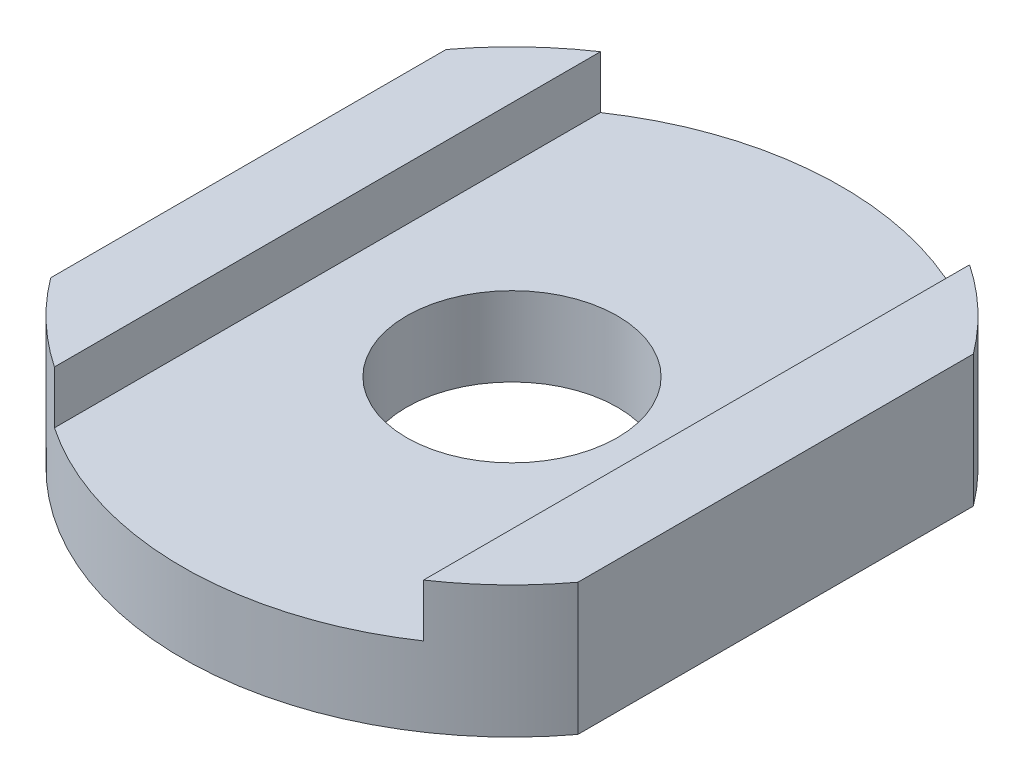
ISO-10303-21;
HEADER;
FILE_DESCRIPTION(('STEP AP214'),'2;1');
FILE_NAME('part.step','',(''),(''),'','','');
FILE_SCHEMA(('AUTOMOTIVE_DESIGN { 1 0 10303 214 1 1 1 1 }'));
ENDSEC;
DATA;
#1=APPLICATION_CONTEXT('core data for automotive mechanical design processes');
#2=APPLICATION_PROTOCOL_DEFINITION('international standard','automotive_design',2000,#1);
#3=PRODUCT_CONTEXT('',#1,'mechanical');
#4=PRODUCT('Part','Part','',(#3));
#5=PRODUCT_RELATED_PRODUCT_CATEGORY('part','',(#4));
#6=PRODUCT_DEFINITION_FORMATION('','',#4);
#7=PRODUCT_DEFINITION_CONTEXT('part definition',#1,'design');
#8=PRODUCT_DEFINITION('design','',#6,#7);
#9=PRODUCT_DEFINITION_SHAPE('','',#8);
#10=(LENGTH_UNIT() NAMED_UNIT(*) SI_UNIT(.MILLI.,.METRE.));
#11=(NAMED_UNIT(*) PLANE_ANGLE_UNIT() SI_UNIT($,.RADIAN.));
#12=(NAMED_UNIT(*) SI_UNIT($,.STERADIAN.) SOLID_ANGLE_UNIT());
#13=UNCERTAINTY_MEASURE_WITH_UNIT(LENGTH_MEASURE(1.E-05),#10,'distance_accuracy_value','');
#14=(GEOMETRIC_REPRESENTATION_CONTEXT(3) GLOBAL_UNCERTAINTY_ASSIGNED_CONTEXT((#13)) GLOBAL_UNIT_ASSIGNED_CONTEXT((#10,
#11,#12)) REPRESENTATION_CONTEXT('',''));
#15=CARTESIAN_POINT('',(0.,0.,0.));
#16=DIRECTION('',(0.,0.,1.));
#17=DIRECTION('',(1.,0.,0.));
#18=AXIS2_PLACEMENT_3D('',#15,#16,#17);
#19=CARTESIAN_POINT('',(0.,3.,0.));
#20=DIRECTION('',(0.,-1.,0.));
#21=DIRECTION('',(0.,0.,-1.));
#22=AXIS2_PLACEMENT_3D('',#19,#20,#21);
#23=CYLINDRICAL_SURFACE('',#22,12.5);
#24=CARTESIAN_POINT('',(0.,0.,0.));
#25=DIRECTION('',(0.,1.,0.));
#26=DIRECTION('',(0.,0.,1.));
#27=AXIS2_PLACEMENT_3D('',#24,#25,#26);
#28=CIRCLE('',#27,12.5);
#29=CARTESIAN_POINT('',(10.,0.,-7.5));
#30=VERTEX_POINT('',#29);
#31=CARTESIAN_POINT('',(-10.,0.,-7.5));
#32=VERTEX_POINT('',#31);
#33=EDGE_CURVE('E43',#30,#32,#28,.T.);
#34=ORIENTED_EDGE('',*,*,#33,.T.);
#35=DIRECTION('',(0.,-1.,0.));
#36=VECTOR('',#35,1.);
#37=CARTESIAN_POINT('',(-10.,5.,-7.5));
#38=LINE('',#37,#36);
#39=CARTESIAN_POINT('',(-10.,5.,-7.5));
#40=VERTEX_POINT('',#39);
#41=EDGE_CURVE('E151',#40,#32,#38,.T.);
#42=ORIENTED_EDGE('',*,*,#41,.F.);
#43=CARTESIAN_POINT('',(0.,5.,0.));
#44=DIRECTION('',(0.,1.,0.));
#45=DIRECTION('',(0.,0.,1.));
#46=AXIS2_PLACEMENT_3D('',#43,#44,#45);
#47=CIRCLE('',#46,12.5);
#48=CARTESIAN_POINT('',(-7.,5.,-10.356157588604));
#49=VERTEX_POINT('',#48);
#50=EDGE_CURVE('E141',#49,#40,#47,.T.);
#51=ORIENTED_EDGE('',*,*,#50,.F.);
#52=DIRECTION('',(0.,-1.,0.));
#53=VECTOR('',#52,1.);
#54=CARTESIAN_POINT('',(-7.,5.,-10.356157588604));
#55=LINE('',#54,#53);
#56=CARTESIAN_POINT('',(-7.,3.,-10.356157588604));
#57=VERTEX_POINT('',#56);
#58=EDGE_CURVE('E157',#49,#57,#55,.T.);
#59=ORIENTED_EDGE('',*,*,#58,.T.);
#60=CARTESIAN_POINT('',(0.,3.,0.));
#61=DIRECTION('',(0.,1.,0.));
#62=DIRECTION('',(0.,0.,1.));
#63=AXIS2_PLACEMENT_3D('',#60,#61,#62);
#64=CIRCLE('',#63,12.5);
#65=CARTESIAN_POINT('',(7.,3.,-10.356157588604));
#66=VERTEX_POINT('',#65);
#67=EDGE_CURVE('E57',#66,#57,#64,.T.);
#68=ORIENTED_EDGE('',*,*,#67,.F.);
#69=DIRECTION('',(0.,-1.,0.));
#70=VECTOR('',#69,1.);
#71=CARTESIAN_POINT('',(7.,5.,-10.356157588604));
#72=LINE('',#71,#70);
#73=CARTESIAN_POINT('',(7.,5.,-10.356157588604));
#74=VERTEX_POINT('',#73);
#75=EDGE_CURVE('E187',#74,#66,#72,.T.);
#76=ORIENTED_EDGE('',*,*,#75,.F.);
#77=CARTESIAN_POINT('',(0.,5.,0.));
#78=DIRECTION('',(0.,1.,0.));
#79=DIRECTION('',(0.,0.,1.));
#80=AXIS2_PLACEMENT_3D('',#77,#78,#79);
#81=CIRCLE('',#80,12.5);
#82=CARTESIAN_POINT('',(10.,5.,-7.5));
#83=VERTEX_POINT('',#82);
#84=EDGE_CURVE('E121',#83,#74,#81,.T.);
#85=ORIENTED_EDGE('',*,*,#84,.F.);
#86=DIRECTION('',(0.,-1.,0.));
#87=VECTOR('',#86,1.);
#88=CARTESIAN_POINT('',(10.,5.,-7.5));
#89=LINE('',#88,#87);
#90=EDGE_CURVE('E134',#83,#30,#89,.T.);
#91=ORIENTED_EDGE('',*,*,#90,.T.);
#92=EDGE_LOOP('',(#34,#42,#51,#59,#68,#76,#85,#91));
#93=FACE_BOUND('',#92,.T.);
#94=ADVANCED_FACE('F39',(#93),#23,.T.);
#95=CARTESIAN_POINT('',(-10.,0.,7.5));
#96=VERTEX_POINT('',#95);
#97=CARTESIAN_POINT('',(10.,0.,7.5));
#98=VERTEX_POINT('',#97);
#99=EDGE_CURVE('E163',#96,#98,#28,.T.);
#100=ORIENTED_EDGE('',*,*,#99,.T.);
#101=DIRECTION('',(0.,-1.,0.));
#102=VECTOR('',#101,1.);
#103=CARTESIAN_POINT('',(10.,5.,7.5));
#104=LINE('',#103,#102);
#105=CARTESIAN_POINT('',(10.,5.,7.5));
#106=VERTEX_POINT('',#105);
#107=EDGE_CURVE('E118',#106,#98,#104,.T.);
#108=ORIENTED_EDGE('',*,*,#107,.F.);
#109=CARTESIAN_POINT('',(7.,5.,10.356157588604));
#110=VERTEX_POINT('',#109);
#111=EDGE_CURVE('E107',#110,#106,#81,.T.);
#112=ORIENTED_EDGE('',*,*,#111,.F.);
#113=DIRECTION('',(0.,-1.,0.));
#114=VECTOR('',#113,1.);
#115=CARTESIAN_POINT('',(7.,5.,10.356157588604));
#116=LINE('',#115,#114);
#117=CARTESIAN_POINT('',(7.,3.,10.356157588604));
#118=VERTEX_POINT('',#117);
#119=EDGE_CURVE('E114',#110,#118,#116,.T.);
#120=ORIENTED_EDGE('',*,*,#119,.T.);
#121=CARTESIAN_POINT('',(-7.,3.,10.356157588604));
#122=VERTEX_POINT('',#121);
#123=EDGE_CURVE('E48',#122,#118,#64,.T.);
#124=ORIENTED_EDGE('',*,*,#123,.F.);
#125=DIRECTION('',(0.,-1.,0.));
#126=VECTOR('',#125,1.);
#127=CARTESIAN_POINT('',(-7.,5.,10.356157588604));
#128=LINE('',#127,#126);
#129=CARTESIAN_POINT('',(-7.,5.,10.356157588604));
#130=VERTEX_POINT('',#129);
#131=EDGE_CURVE('E62',#130,#122,#128,.T.);
#132=ORIENTED_EDGE('',*,*,#131,.F.);
#133=CARTESIAN_POINT('',(-10.,5.,7.5));
#134=VERTEX_POINT('',#133);
#135=EDGE_CURVE('E144',#134,#130,#47,.T.);
#136=ORIENTED_EDGE('',*,*,#135,.F.);
#137=DIRECTION('',(0.,-1.,0.));
#138=VECTOR('',#137,1.);
#139=CARTESIAN_POINT('',(-10.,5.,7.5));
#140=LINE('',#139,#138);
#141=EDGE_CURVE('E148',#134,#96,#140,.T.);
#142=ORIENTED_EDGE('',*,*,#141,.T.);
#143=EDGE_LOOP('',(#100,#108,#112,#120,#124,#132,#136,#142));
#144=FACE_BOUND('',#143,.T.);
#145=ADVANCED_FACE('F112',(#144),#23,.T.);
#146=CARTESIAN_POINT('',(0.,3.,0.));
#147=DIRECTION('',(0.,-1.,0.));
#148=DIRECTION('',(0.,0.,-1.));
#149=AXIS2_PLACEMENT_3D('',#146,#147,#148);
#150=CYLINDRICAL_SURFACE('',#149,4.);
#151=CARTESIAN_POINT('',(0.,3.,0.));
#152=DIRECTION('',(0.,1.,0.));
#153=DIRECTION('',(0.,0.,1.));
#154=AXIS2_PLACEMENT_3D('',#151,#152,#153);
#155=CIRCLE('',#154,4.);
#156=CARTESIAN_POINT('',(0.,3.,4.));
#157=VERTEX_POINT('',#156);
#158=EDGE_CURVE('E156',#157,#157,#155,.T.);
#159=ORIENTED_EDGE('',*,*,#158,.T.);
#160=EDGE_LOOP('',(#159));
#161=FACE_BOUND('',#160,.T.);
#162=CARTESIAN_POINT('',(0.,0.,0.));
#163=DIRECTION('',(0.,1.,0.));
#164=DIRECTION('',(0.,0.,1.));
#165=AXIS2_PLACEMENT_3D('',#162,#163,#164);
#166=CIRCLE('',#165,4.);
#167=CARTESIAN_POINT('',(0.,0.,4.));
#168=VERTEX_POINT('',#167);
#169=EDGE_CURVE('E135',#168,#168,#166,.T.);
#170=ORIENTED_EDGE('',*,*,#169,.F.);
#171=EDGE_LOOP('',(#170));
#172=FACE_BOUND('',#171,.T.);
#173=ADVANCED_FACE('F41',(#161,#172),#150,.F.);
#174=CARTESIAN_POINT('',(0.,3.,0.));
#175=DIRECTION('',(0.,1.,0.));
#176=DIRECTION('',(0.,0.,1.));
#177=AXIS2_PLACEMENT_3D('',#174,#175,#176);
#178=PLANE('',#177);
#179=ORIENTED_EDGE('',*,*,#158,.F.);
#180=EDGE_LOOP('',(#179));
#181=FACE_BOUND('',#180,.T.);
#182=ORIENTED_EDGE('',*,*,#67,.T.);
#183=DIRECTION('',(0.,0.,1.));
#184=VECTOR('',#183,1.);
#185=CARTESIAN_POINT('',(-7.,3.,0.));
#186=LINE('',#185,#184);
#187=EDGE_CURVE('E161',#57,#122,#186,.T.);
#188=ORIENTED_EDGE('',*,*,#187,.T.);
#189=ORIENTED_EDGE('',*,*,#123,.T.);
#190=DIRECTION('',(0.,0.,1.));
#191=VECTOR('',#190,1.);
#192=CARTESIAN_POINT('',(7.,3.,0.));
#193=LINE('',#192,#191);
#194=EDGE_CURVE('E11',#66,#118,#193,.T.);
#195=ORIENTED_EDGE('',*,*,#194,.F.);
#196=EDGE_LOOP('',(#182,#188,#189,#195));
#197=FACE_BOUND('',#196,.T.);
#198=ADVANCED_FACE('F164',(#181,#197),#178,.T.);
#199=CARTESIAN_POINT('',(0.,0.,0.));
#200=DIRECTION('',(0.,1.,0.));
#201=DIRECTION('',(0.,0.,1.));
#202=AXIS2_PLACEMENT_3D('',#199,#200,#201);
#203=PLANE('',#202);
#204=ORIENTED_EDGE('',*,*,#169,.T.);
#205=EDGE_LOOP('',(#204));
#206=FACE_BOUND('',#205,.T.);
#207=ORIENTED_EDGE('',*,*,#33,.F.);
#208=DIRECTION('',(0.,0.,1.));
#209=VECTOR('',#208,1.);
#210=CARTESIAN_POINT('',(10.,0.,0.));
#211=LINE('',#210,#209);
#212=EDGE_CURVE('E129',#30,#98,#211,.T.);
#213=ORIENTED_EDGE('',*,*,#212,.T.);
#214=ORIENTED_EDGE('',*,*,#99,.F.);
#215=DIRECTION('',(0.,0.,1.));
#216=VECTOR('',#215,1.);
#217=CARTESIAN_POINT('',(-10.,0.,0.));
#218=LINE('',#217,#216);
#219=EDGE_CURVE('E145',#32,#96,#218,.T.);
#220=ORIENTED_EDGE('',*,*,#219,.F.);
#221=EDGE_LOOP('',(#207,#213,#214,#220));
#222=FACE_BOUND('',#221,.T.);
#223=ADVANCED_FACE('F183',(#206,#222),#203,.F.);
#224=CARTESIAN_POINT('',(7.,5.,0.));
#225=DIRECTION('',(1.,0.,0.));
#226=DIRECTION('',(0.,0.,-1.));
#227=AXIS2_PLACEMENT_3D('',#224,#225,#226);
#228=PLANE('',#227);
#229=ORIENTED_EDGE('',*,*,#75,.T.);
#230=ORIENTED_EDGE('',*,*,#194,.T.);
#231=ORIENTED_EDGE('',*,*,#119,.F.);
#232=DIRECTION('',(0.,0.,1.));
#233=VECTOR('',#232,1.);
#234=CARTESIAN_POINT('',(7.,5.,0.));
#235=LINE('',#234,#233);
#236=EDGE_CURVE('E123',#74,#110,#235,.T.);
#237=ORIENTED_EDGE('',*,*,#236,.F.);
#238=EDGE_LOOP('',(#229,#230,#231,#237));
#239=FACE_BOUND('',#238,.T.);
#240=ADVANCED_FACE('F131',(#239),#228,.F.);
#241=CARTESIAN_POINT('',(10.,5.,0.));
#242=DIRECTION('',(1.,0.,0.));
#243=DIRECTION('',(0.,0.,-1.));
#244=AXIS2_PLACEMENT_3D('',#241,#242,#243);
#245=PLANE('',#244);
#246=ORIENTED_EDGE('',*,*,#212,.F.);
#247=ORIENTED_EDGE('',*,*,#90,.F.);
#248=DIRECTION('',(0.,0.,1.));
#249=VECTOR('',#248,1.);
#250=CARTESIAN_POINT('',(10.,5.,0.));
#251=LINE('',#250,#249);
#252=EDGE_CURVE('E119',#83,#106,#251,.T.);
#253=ORIENTED_EDGE('',*,*,#252,.T.);
#254=ORIENTED_EDGE('',*,*,#107,.T.);
#255=EDGE_LOOP('',(#246,#247,#253,#254));
#256=FACE_BOUND('',#255,.T.);
#257=ADVANCED_FACE('F185',(#256),#245,.T.);
#258=CARTESIAN_POINT('',(0.,5.,0.));
#259=DIRECTION('',(0.,1.,0.));
#260=DIRECTION('',(0.,0.,1.));
#261=AXIS2_PLACEMENT_3D('',#258,#259,#260);
#262=PLANE('',#261);
#263=ORIENTED_EDGE('',*,*,#236,.T.);
#264=ORIENTED_EDGE('',*,*,#111,.T.);
#265=ORIENTED_EDGE('',*,*,#252,.F.);
#266=ORIENTED_EDGE('',*,*,#84,.T.);
#267=EDGE_LOOP('',(#263,#264,#265,#266));
#268=FACE_BOUND('',#267,.T.);
#269=ADVANCED_FACE('F124',(#268),#262,.T.);
#270=CARTESIAN_POINT('',(-7.,5.,0.));
#271=DIRECTION('',(1.,0.,0.));
#272=DIRECTION('',(0.,0.,-1.));
#273=AXIS2_PLACEMENT_3D('',#270,#271,#272);
#274=PLANE('',#273);
#275=ORIENTED_EDGE('',*,*,#187,.F.);
#276=ORIENTED_EDGE('',*,*,#58,.F.);
#277=DIRECTION('',(0.,0.,1.));
#278=VECTOR('',#277,1.);
#279=CARTESIAN_POINT('',(-7.,5.,0.));
#280=LINE('',#279,#278);
#281=EDGE_CURVE('E137',#49,#130,#280,.T.);
#282=ORIENTED_EDGE('',*,*,#281,.T.);
#283=ORIENTED_EDGE('',*,*,#131,.T.);
#284=EDGE_LOOP('',(#275,#276,#282,#283));
#285=FACE_BOUND('',#284,.T.);
#286=ADVANCED_FACE('F166',(#285),#274,.T.);
#287=CARTESIAN_POINT('',(-10.,5.,0.));
#288=DIRECTION('',(1.,0.,0.));
#289=DIRECTION('',(0.,0.,-1.));
#290=AXIS2_PLACEMENT_3D('',#287,#288,#289);
#291=PLANE('',#290);
#292=ORIENTED_EDGE('',*,*,#219,.T.);
#293=ORIENTED_EDGE('',*,*,#141,.F.);
#294=DIRECTION('',(0.,0.,1.));
#295=VECTOR('',#294,1.);
#296=CARTESIAN_POINT('',(-10.,5.,0.));
#297=LINE('',#296,#295);
#298=EDGE_CURVE('E143',#40,#134,#297,.T.);
#299=ORIENTED_EDGE('',*,*,#298,.F.);
#300=ORIENTED_EDGE('',*,*,#41,.T.);
#301=EDGE_LOOP('',(#292,#293,#299,#300));
#302=FACE_BOUND('',#301,.T.);
#303=ADVANCED_FACE('F176',(#302),#291,.F.);
#304=CARTESIAN_POINT('',(0.,5.,0.));
#305=DIRECTION('',(0.,1.,0.));
#306=DIRECTION('',(0.,0.,1.));
#307=AXIS2_PLACEMENT_3D('',#304,#305,#306);
#308=PLANE('',#307);
#309=ORIENTED_EDGE('',*,*,#281,.F.);
#310=ORIENTED_EDGE('',*,*,#50,.T.);
#311=ORIENTED_EDGE('',*,*,#298,.T.);
#312=ORIENTED_EDGE('',*,*,#135,.T.);
#313=EDGE_LOOP('',(#309,#310,#311,#312));
#314=FACE_BOUND('',#313,.T.);
#315=ADVANCED_FACE('F173',(#314),#308,.T.);
#316=CLOSED_SHELL('',(#94,#145,#173,#198,#223,#240,#257,#269,#286,#303,#315));
#317=MANIFOLD_SOLID_BREP('B2',#316);
#318=ADVANCED_BREP_SHAPE_REPRESENTATION('',(#18,#317),#14);
#319=SHAPE_DEFINITION_REPRESENTATION(#9,#318);
ENDSEC;
END-ISO-10303-21;
